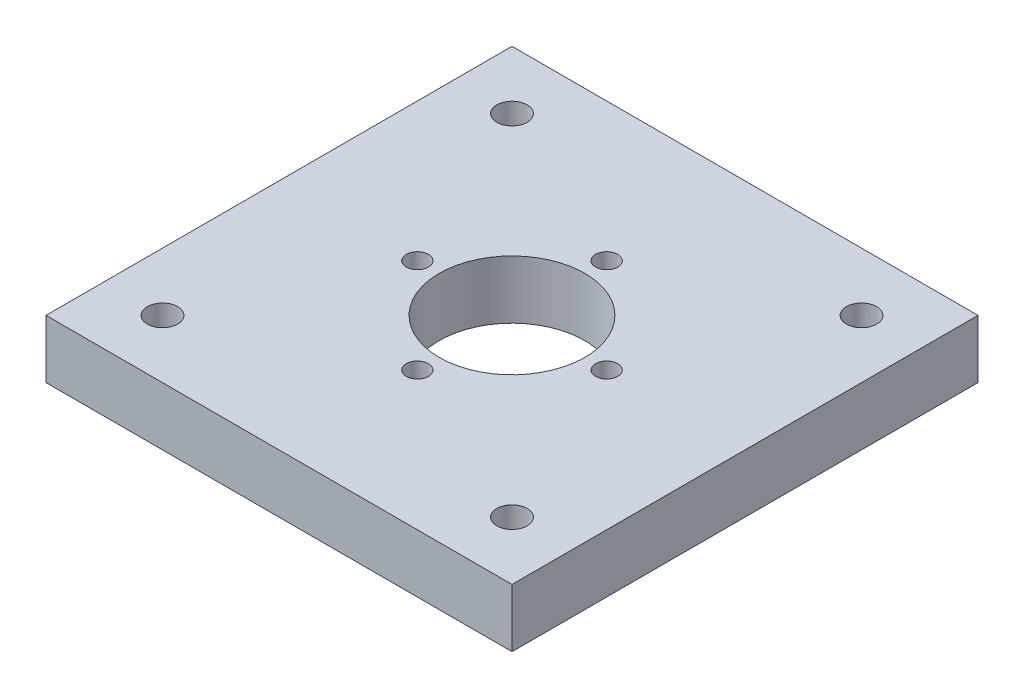
ISO-10303-21;
HEADER;
FILE_DESCRIPTION(('STEP AP214'),'2;1');
FILE_NAME('part.step','',(''),(''),'','','');
FILE_SCHEMA(('AUTOMOTIVE_DESIGN { 1 0 10303 214 1 1 1 1 }'));
ENDSEC;
DATA;
#1=APPLICATION_CONTEXT('core data for automotive mechanical design processes');
#2=APPLICATION_PROTOCOL_DEFINITION('international standard','automotive_design',2000,#1);
#3=PRODUCT_CONTEXT('',#1,'mechanical');
#4=PRODUCT('Part','Part','',(#3));
#5=PRODUCT_RELATED_PRODUCT_CATEGORY('part','',(#4));
#6=PRODUCT_DEFINITION_FORMATION('','',#4);
#7=PRODUCT_DEFINITION_CONTEXT('part definition',#1,'design');
#8=PRODUCT_DEFINITION('design','',#6,#7);
#9=PRODUCT_DEFINITION_SHAPE('','',#8);
#10=(LENGTH_UNIT() NAMED_UNIT(*) SI_UNIT(.MILLI.,.METRE.));
#11=(NAMED_UNIT(*) PLANE_ANGLE_UNIT() SI_UNIT($,.RADIAN.));
#12=(NAMED_UNIT(*) SI_UNIT($,.STERADIAN.) SOLID_ANGLE_UNIT());
#13=UNCERTAINTY_MEASURE_WITH_UNIT(LENGTH_MEASURE(1.E-05),#10,'distance_accuracy_value','');
#14=(GEOMETRIC_REPRESENTATION_CONTEXT(3) GLOBAL_UNCERTAINTY_ASSIGNED_CONTEXT((#13)) GLOBAL_UNIT_ASSIGNED_CONTEXT((#10,
#11,#12)) REPRESENTATION_CONTEXT('',''));
#15=CARTESIAN_POINT('',(0.,0.,0.));
#16=DIRECTION('',(0.,0.,1.));
#17=DIRECTION('',(1.,0.,0.));
#18=AXIS2_PLACEMENT_3D('',#15,#16,#17);
#19=CARTESIAN_POINT('',(50.8,6.35,-50.8));
#20=DIRECTION('',(-1.,0.,0.));
#21=DIRECTION('',(0.,0.,1.));
#22=AXIS2_PLACEMENT_3D('',#19,#20,#21);
#23=PLANE('',#22);
#24=DIRECTION('',(0.,0.,-1.));
#25=VECTOR('',#24,1.);
#26=CARTESIAN_POINT('',(50.8,-6.35,-50.8));
#27=LINE('',#26,#25);
#28=CARTESIAN_POINT('',(50.8,-6.35,50.8));
#29=VERTEX_POINT('',#28);
#30=CARTESIAN_POINT('',(50.8,-6.35,-50.8));
#31=VERTEX_POINT('',#30);
#32=EDGE_CURVE('E102',#29,#31,#27,.T.);
#33=ORIENTED_EDGE('',*,*,#32,.T.);
#34=DIRECTION('',(0.,-1.,0.));
#35=VECTOR('',#34,1.);
#36=CARTESIAN_POINT('',(50.8,6.35,-50.8));
#37=LINE('',#36,#35);
#38=CARTESIAN_POINT('',(50.8,6.35,-50.8));
#39=VERTEX_POINT('',#38);
#40=EDGE_CURVE('E11',#39,#31,#37,.T.);
#41=ORIENTED_EDGE('',*,*,#40,.F.);
#42=DIRECTION('',(0.,0.,-1.));
#43=VECTOR('',#42,1.);
#44=CARTESIAN_POINT('',(50.8,6.35,-50.8));
#45=LINE('',#44,#43);
#46=CARTESIAN_POINT('',(50.8,6.35,50.8));
#47=VERTEX_POINT('',#46);
#48=EDGE_CURVE('E90',#47,#39,#45,.T.);
#49=ORIENTED_EDGE('',*,*,#48,.F.);
#50=DIRECTION('',(0.,-1.,0.));
#51=VECTOR('',#50,1.);
#52=CARTESIAN_POINT('',(50.8,6.35,50.8));
#53=LINE('',#52,#51);
#54=EDGE_CURVE('E98',#47,#29,#53,.T.);
#55=ORIENTED_EDGE('',*,*,#54,.T.);
#56=EDGE_LOOP('',(#33,#41,#49,#55));
#57=FACE_BOUND('',#56,.T.);
#58=ADVANCED_FACE('F39',(#57),#23,.F.);
#59=CARTESIAN_POINT('',(-50.8,6.35,-50.8));
#60=DIRECTION('',(0.,0.,1.));
#61=DIRECTION('',(1.,0.,0.));
#62=AXIS2_PLACEMENT_3D('',#59,#60,#61);
#63=PLANE('',#62);
#64=DIRECTION('',(-1.,0.,0.));
#65=VECTOR('',#64,1.);
#66=CARTESIAN_POINT('',(-50.8,-6.35,-50.8));
#67=LINE('',#66,#65);
#68=CARTESIAN_POINT('',(-50.8,-6.35,-50.8));
#69=VERTEX_POINT('',#68);
#70=EDGE_CURVE('E94',#31,#69,#67,.T.);
#71=ORIENTED_EDGE('',*,*,#70,.T.);
#72=DIRECTION('',(0.,-1.,0.));
#73=VECTOR('',#72,1.);
#74=CARTESIAN_POINT('',(-50.8,6.35,-50.8));
#75=LINE('',#74,#73);
#76=CARTESIAN_POINT('',(-50.8,6.35,-50.8));
#77=VERTEX_POINT('',#76);
#78=EDGE_CURVE('E47',#77,#69,#75,.T.);
#79=ORIENTED_EDGE('',*,*,#78,.F.);
#80=DIRECTION('',(-1.,0.,0.));
#81=VECTOR('',#80,1.);
#82=CARTESIAN_POINT('',(-50.8,6.35,-50.8));
#83=LINE('',#82,#81);
#84=EDGE_CURVE('E85',#39,#77,#83,.T.);
#85=ORIENTED_EDGE('',*,*,#84,.F.);
#86=ORIENTED_EDGE('',*,*,#40,.T.);
#87=EDGE_LOOP('',(#71,#79,#85,#86));
#88=FACE_BOUND('',#87,.T.);
#89=ADVANCED_FACE('F93',(#88),#63,.F.);
#90=CARTESIAN_POINT('',(-50.8,6.35,-50.8));
#91=DIRECTION('',(1.,0.,0.));
#92=DIRECTION('',(0.,0.,-1.));
#93=AXIS2_PLACEMENT_3D('',#90,#91,#92);
#94=PLANE('',#93);
#95=DIRECTION('',(0.,0.,1.));
#96=VECTOR('',#95,1.);
#97=CARTESIAN_POINT('',(-50.8,-6.35,-50.8));
#98=LINE('',#97,#96);
#99=CARTESIAN_POINT('',(-50.8,-6.35,50.8));
#100=VERTEX_POINT('',#99);
#101=EDGE_CURVE('E72',#69,#100,#98,.T.);
#102=ORIENTED_EDGE('',*,*,#101,.T.);
#103=DIRECTION('',(0.,-1.,0.));
#104=VECTOR('',#103,1.);
#105=CARTESIAN_POINT('',(-50.8,6.35,50.8));
#106=LINE('',#105,#104);
#107=CARTESIAN_POINT('',(-50.8,6.35,50.8));
#108=VERTEX_POINT('',#107);
#109=EDGE_CURVE('E95',#108,#100,#106,.T.);
#110=ORIENTED_EDGE('',*,*,#109,.F.);
#111=DIRECTION('',(0.,0.,1.));
#112=VECTOR('',#111,1.);
#113=CARTESIAN_POINT('',(-50.8,6.35,-50.8));
#114=LINE('',#113,#112);
#115=EDGE_CURVE('E88',#77,#108,#114,.T.);
#116=ORIENTED_EDGE('',*,*,#115,.F.);
#117=ORIENTED_EDGE('',*,*,#78,.T.);
#118=EDGE_LOOP('',(#102,#110,#116,#117));
#119=FACE_BOUND('',#118,.T.);
#120=ADVANCED_FACE('F96',(#119),#94,.F.);
#121=CARTESIAN_POINT('',(-50.8,6.35,50.8));
#122=DIRECTION('',(0.,0.,-1.));
#123=DIRECTION('',(-1.,0.,0.));
#124=AXIS2_PLACEMENT_3D('',#121,#122,#123);
#125=PLANE('',#124);
#126=DIRECTION('',(1.,0.,0.));
#127=VECTOR('',#126,1.);
#128=CARTESIAN_POINT('',(-50.8,-6.35,50.8));
#129=LINE('',#128,#127);
#130=EDGE_CURVE('E78',#100,#29,#129,.T.);
#131=ORIENTED_EDGE('',*,*,#130,.T.);
#132=ORIENTED_EDGE('',*,*,#54,.F.);
#133=DIRECTION('',(1.,0.,0.));
#134=VECTOR('',#133,1.);
#135=CARTESIAN_POINT('',(-50.8,6.35,50.8));
#136=LINE('',#135,#134);
#137=EDGE_CURVE('E55',#108,#47,#136,.T.);
#138=ORIENTED_EDGE('',*,*,#137,.F.);
#139=ORIENTED_EDGE('',*,*,#109,.T.);
#140=EDGE_LOOP('',(#131,#132,#138,#139));
#141=FACE_BOUND('',#140,.T.);
#142=ADVANCED_FACE('F110',(#141),#125,.F.);
#143=CARTESIAN_POINT('',(0.,6.35,0.));
#144=DIRECTION('',(0.,1.,0.));
#145=DIRECTION('',(0.,0.,1.));
#146=AXIS2_PLACEMENT_3D('',#143,#144,#145);
#147=PLANE('',#146);
#148=CARTESIAN_POINT('',(0.,6.35,-20.6375));
#149=DIRECTION('',(0.,1.,0.));
#150=DIRECTION('',(0.,0.,1.));
#151=AXIS2_PLACEMENT_3D('',#148,#149,#150);
#152=CIRCLE('',#151,2.413);
#153=CARTESIAN_POINT('',(0.,6.35,-18.2245));
#154=VERTEX_POINT('',#153);
#155=EDGE_CURVE('E143',#154,#154,#152,.T.);
#156=ORIENTED_EDGE('',*,*,#155,.F.);
#157=EDGE_LOOP('',(#156));
#158=FACE_BOUND('',#157,.T.);
#159=CARTESIAN_POINT('',(20.6375,6.35,0.));
#160=DIRECTION('',(0.,1.,0.));
#161=DIRECTION('',(0.,0.,1.));
#162=AXIS2_PLACEMENT_3D('',#159,#160,#161);
#163=CIRCLE('',#162,2.413);
#164=CARTESIAN_POINT('',(20.6375,6.35,2.413));
#165=VERTEX_POINT('',#164);
#166=EDGE_CURVE('E149',#165,#165,#163,.T.);
#167=ORIENTED_EDGE('',*,*,#166,.F.);
#168=EDGE_LOOP('',(#167));
#169=FACE_BOUND('',#168,.T.);
#170=CARTESIAN_POINT('',(0.,6.35,20.6375));
#171=DIRECTION('',(0.,1.,0.));
#172=DIRECTION('',(0.,0.,1.));
#173=AXIS2_PLACEMENT_3D('',#170,#171,#172);
#174=CIRCLE('',#173,2.413);
#175=CARTESIAN_POINT('',(0.,6.35,23.0505));
#176=VERTEX_POINT('',#175);
#177=EDGE_CURVE('E150',#176,#176,#174,.T.);
#178=ORIENTED_EDGE('',*,*,#177,.F.);
#179=EDGE_LOOP('',(#178));
#180=FACE_BOUND('',#179,.T.);
#181=CARTESIAN_POINT('',(-20.6375,6.35,0.));
#182=DIRECTION('',(0.,1.,0.));
#183=DIRECTION('',(0.,0.,1.));
#184=AXIS2_PLACEMENT_3D('',#181,#182,#183);
#185=CIRCLE('',#184,2.413);
#186=CARTESIAN_POINT('',(-20.6375,6.35,2.413));
#187=VERTEX_POINT('',#186);
#188=EDGE_CURVE('E161',#187,#187,#185,.T.);
#189=ORIENTED_EDGE('',*,*,#188,.F.);
#190=EDGE_LOOP('',(#189));
#191=FACE_BOUND('',#190,.T.);
#192=CARTESIAN_POINT('',(0.,6.35,0.));
#193=DIRECTION('',(0.,1.,0.));
#194=DIRECTION('',(0.,0.,1.));
#195=AXIS2_PLACEMENT_3D('',#192,#193,#194);
#196=CIRCLE('',#195,15.875);
#197=CARTESIAN_POINT('',(0.,6.35,15.875));
#198=VERTEX_POINT('',#197);
#199=EDGE_CURVE('E140',#198,#198,#196,.T.);
#200=ORIENTED_EDGE('',*,*,#199,.F.);
#201=EDGE_LOOP('',(#200));
#202=FACE_BOUND('',#201,.T.);
#203=CARTESIAN_POINT('',(-38.1,6.35,-38.1));
#204=DIRECTION('',(0.,1.,0.));
#205=DIRECTION('',(0.,0.,-1.));
#206=AXIS2_PLACEMENT_3D('',#203,#204,#205);
#207=CIRCLE('',#206,3.302);
#208=CARTESIAN_POINT('',(-38.1,6.35,-41.402));
#209=VERTEX_POINT('',#208);
#210=EDGE_CURVE('E119',#209,#209,#207,.T.);
#211=ORIENTED_EDGE('',*,*,#210,.F.);
#212=EDGE_LOOP('',(#211));
#213=FACE_BOUND('',#212,.T.);
#214=CARTESIAN_POINT('',(38.1,6.35,38.1));
#215=DIRECTION('',(0.,1.,0.));
#216=DIRECTION('',(0.,0.,-1.));
#217=AXIS2_PLACEMENT_3D('',#214,#215,#216);
#218=CIRCLE('',#217,3.302);
#219=CARTESIAN_POINT('',(38.1,6.35,34.798));
#220=VERTEX_POINT('',#219);
#221=EDGE_CURVE('E125',#220,#220,#218,.T.);
#222=ORIENTED_EDGE('',*,*,#221,.F.);
#223=EDGE_LOOP('',(#222));
#224=FACE_BOUND('',#223,.T.);
#225=CARTESIAN_POINT('',(38.1,6.35,-38.1));
#226=DIRECTION('',(0.,1.,0.));
#227=DIRECTION('',(0.,0.,1.));
#228=AXIS2_PLACEMENT_3D('',#225,#226,#227);
#229=CIRCLE('',#228,3.302);
#230=CARTESIAN_POINT('',(38.1,6.35,-34.798));
#231=VERTEX_POINT('',#230);
#232=EDGE_CURVE('E126',#231,#231,#229,.T.);
#233=ORIENTED_EDGE('',*,*,#232,.F.);
#234=EDGE_LOOP('',(#233));
#235=FACE_BOUND('',#234,.T.);
#236=CARTESIAN_POINT('',(-38.1,6.35,38.1));
#237=DIRECTION('',(0.,1.,0.));
#238=DIRECTION('',(0.,0.,1.));
#239=AXIS2_PLACEMENT_3D('',#236,#237,#238);
#240=CIRCLE('',#239,3.302);
#241=CARTESIAN_POINT('',(-38.1,6.35,41.402));
#242=VERTEX_POINT('',#241);
#243=EDGE_CURVE('E116',#242,#242,#240,.T.);
#244=ORIENTED_EDGE('',*,*,#243,.F.);
#245=EDGE_LOOP('',(#244));
#246=FACE_BOUND('',#245,.T.);
#247=ORIENTED_EDGE('',*,*,#48,.T.);
#248=ORIENTED_EDGE('',*,*,#84,.T.);
#249=ORIENTED_EDGE('',*,*,#115,.T.);
#250=ORIENTED_EDGE('',*,*,#137,.T.);
#251=EDGE_LOOP('',(#247,#248,#249,#250));
#252=FACE_BOUND('',#251,.T.);
#253=ADVANCED_FACE('F86',(#158,#169,#180,#191,#202,#213,#224,#235,#246,#252),#147,.T.);
#254=CARTESIAN_POINT('',(0.,-6.35,0.));
#255=DIRECTION('',(0.,1.,0.));
#256=DIRECTION('',(0.,0.,1.));
#257=AXIS2_PLACEMENT_3D('',#254,#255,#256);
#258=PLANE('',#257);
#259=CARTESIAN_POINT('',(0.,-6.35,-20.6375));
#260=DIRECTION('',(0.,1.,0.));
#261=DIRECTION('',(0.,0.,1.));
#262=AXIS2_PLACEMENT_3D('',#259,#260,#261);
#263=CIRCLE('',#262,2.413);
#264=CARTESIAN_POINT('',(0.,-6.35,-18.2245));
#265=VERTEX_POINT('',#264);
#266=EDGE_CURVE('E153',#265,#265,#263,.T.);
#267=ORIENTED_EDGE('',*,*,#266,.T.);
#268=EDGE_LOOP('',(#267));
#269=FACE_BOUND('',#268,.T.);
#270=CARTESIAN_POINT('',(20.6375,-6.35,0.));
#271=DIRECTION('',(0.,1.,0.));
#272=DIRECTION('',(0.,0.,1.));
#273=AXIS2_PLACEMENT_3D('',#270,#271,#272);
#274=CIRCLE('',#273,2.413);
#275=CARTESIAN_POINT('',(20.6375,-6.35,2.413));
#276=VERTEX_POINT('',#275);
#277=EDGE_CURVE('E146',#276,#276,#274,.T.);
#278=ORIENTED_EDGE('',*,*,#277,.T.);
#279=EDGE_LOOP('',(#278));
#280=FACE_BOUND('',#279,.T.);
#281=CARTESIAN_POINT('',(0.,-6.35,20.6375));
#282=DIRECTION('',(0.,1.,0.));
#283=DIRECTION('',(0.,0.,1.));
#284=AXIS2_PLACEMENT_3D('',#281,#282,#283);
#285=CIRCLE('',#284,2.413);
#286=CARTESIAN_POINT('',(0.,-6.35,23.0505));
#287=VERTEX_POINT('',#286);
#288=EDGE_CURVE('E164',#287,#287,#285,.T.);
#289=ORIENTED_EDGE('',*,*,#288,.T.);
#290=EDGE_LOOP('',(#289));
#291=FACE_BOUND('',#290,.T.);
#292=CARTESIAN_POINT('',(-20.6375,-6.35,0.));
#293=DIRECTION('',(0.,1.,0.));
#294=DIRECTION('',(0.,0.,1.));
#295=AXIS2_PLACEMENT_3D('',#292,#293,#294);
#296=CIRCLE('',#295,2.413);
#297=CARTESIAN_POINT('',(-20.6375,-6.35,2.413));
#298=VERTEX_POINT('',#297);
#299=EDGE_CURVE('E158',#298,#298,#296,.T.);
#300=ORIENTED_EDGE('',*,*,#299,.T.);
#301=EDGE_LOOP('',(#300));
#302=FACE_BOUND('',#301,.T.);
#303=CARTESIAN_POINT('',(0.,-6.35,0.));
#304=DIRECTION('',(0.,1.,0.));
#305=DIRECTION('',(0.,0.,1.));
#306=AXIS2_PLACEMENT_3D('',#303,#304,#305);
#307=CIRCLE('',#306,15.875);
#308=CARTESIAN_POINT('',(0.,-6.35,15.875));
#309=VERTEX_POINT('',#308);
#310=EDGE_CURVE('E137',#309,#309,#307,.T.);
#311=ORIENTED_EDGE('',*,*,#310,.T.);
#312=EDGE_LOOP('',(#311));
#313=FACE_BOUND('',#312,.T.);
#314=CARTESIAN_POINT('',(-38.1,-6.35,-38.1));
#315=DIRECTION('',(0.,1.,0.));
#316=DIRECTION('',(0.,0.,-1.));
#317=AXIS2_PLACEMENT_3D('',#314,#315,#316);
#318=CIRCLE('',#317,3.302);
#319=CARTESIAN_POINT('',(-38.1,-6.35,-41.402));
#320=VERTEX_POINT('',#319);
#321=EDGE_CURVE('E129',#320,#320,#318,.T.);
#322=ORIENTED_EDGE('',*,*,#321,.T.);
#323=EDGE_LOOP('',(#322));
#324=FACE_BOUND('',#323,.T.);
#325=CARTESIAN_POINT('',(38.1,-6.35,38.1));
#326=DIRECTION('',(0.,1.,0.));
#327=DIRECTION('',(0.,0.,-1.));
#328=AXIS2_PLACEMENT_3D('',#325,#326,#327);
#329=CIRCLE('',#328,3.302);
#330=CARTESIAN_POINT('',(38.1,-6.35,34.798));
#331=VERTEX_POINT('',#330);
#332=EDGE_CURVE('E122',#331,#331,#329,.T.);
#333=ORIENTED_EDGE('',*,*,#332,.T.);
#334=EDGE_LOOP('',(#333));
#335=FACE_BOUND('',#334,.T.);
#336=CARTESIAN_POINT('',(38.1,-6.35,-38.1));
#337=DIRECTION('',(0.,1.,0.));
#338=DIRECTION('',(0.,0.,1.));
#339=AXIS2_PLACEMENT_3D('',#336,#337,#338);
#340=CIRCLE('',#339,3.302);
#341=CARTESIAN_POINT('',(38.1,-6.35,-34.798));
#342=VERTEX_POINT('',#341);
#343=EDGE_CURVE('E134',#342,#342,#340,.T.);
#344=ORIENTED_EDGE('',*,*,#343,.T.);
#345=EDGE_LOOP('',(#344));
#346=FACE_BOUND('',#345,.T.);
#347=CARTESIAN_POINT('',(-38.1,-6.35,38.1));
#348=DIRECTION('',(0.,1.,0.));
#349=DIRECTION('',(0.,0.,1.));
#350=AXIS2_PLACEMENT_3D('',#347,#348,#349);
#351=CIRCLE('',#350,3.302);
#352=CARTESIAN_POINT('',(-38.1,-6.35,41.402));
#353=VERTEX_POINT('',#352);
#354=EDGE_CURVE('E105',#353,#353,#351,.T.);
#355=ORIENTED_EDGE('',*,*,#354,.T.);
#356=EDGE_LOOP('',(#355));
#357=FACE_BOUND('',#356,.T.);
#358=ORIENTED_EDGE('',*,*,#32,.F.);
#359=ORIENTED_EDGE('',*,*,#130,.F.);
#360=ORIENTED_EDGE('',*,*,#101,.F.);
#361=ORIENTED_EDGE('',*,*,#70,.F.);
#362=EDGE_LOOP('',(#358,#359,#360,#361));
#363=FACE_BOUND('',#362,.T.);
#364=ADVANCED_FACE('F113',(#269,#280,#291,#302,#313,#324,#335,#346,#357,#363),#258,.F.);
#365=CARTESIAN_POINT('',(-38.1,-6.35,38.1));
#366=DIRECTION('',(0.,1.,0.));
#367=DIRECTION('',(0.,0.,1.));
#368=AXIS2_PLACEMENT_3D('',#365,#366,#367);
#369=CYLINDRICAL_SURFACE('',#368,3.302);
#370=ORIENTED_EDGE('',*,*,#354,.F.);
#371=EDGE_LOOP('',(#370));
#372=FACE_BOUND('',#371,.T.);
#373=ORIENTED_EDGE('',*,*,#243,.T.);
#374=EDGE_LOOP('',(#373));
#375=FACE_BOUND('',#374,.T.);
#376=ADVANCED_FACE('F188',(#372,#375),#369,.F.);
#377=CARTESIAN_POINT('',(38.1,-6.35,-38.1));
#378=DIRECTION('',(0.,1.,0.));
#379=DIRECTION('',(0.,0.,1.));
#380=AXIS2_PLACEMENT_3D('',#377,#378,#379);
#381=CYLINDRICAL_SURFACE('',#380,3.302);
#382=ORIENTED_EDGE('',*,*,#343,.F.);
#383=EDGE_LOOP('',(#382));
#384=FACE_BOUND('',#383,.T.);
#385=ORIENTED_EDGE('',*,*,#232,.T.);
#386=EDGE_LOOP('',(#385));
#387=FACE_BOUND('',#386,.T.);
#388=ADVANCED_FACE('F190',(#384,#387),#381,.F.);
#389=CARTESIAN_POINT('',(38.1,-6.35,38.1));
#390=DIRECTION('',(0.,1.,0.));
#391=DIRECTION('',(0.,0.,1.));
#392=AXIS2_PLACEMENT_3D('',#389,#390,#391);
#393=CYLINDRICAL_SURFACE('',#392,3.302);
#394=ORIENTED_EDGE('',*,*,#332,.F.);
#395=EDGE_LOOP('',(#394));
#396=FACE_BOUND('',#395,.T.);
#397=ORIENTED_EDGE('',*,*,#221,.T.);
#398=EDGE_LOOP('',(#397));
#399=FACE_BOUND('',#398,.T.);
#400=ADVANCED_FACE('F197',(#396,#399),#393,.F.);
#401=CARTESIAN_POINT('',(-38.1,-6.35,-38.1));
#402=DIRECTION('',(0.,1.,0.));
#403=DIRECTION('',(0.,0.,1.));
#404=AXIS2_PLACEMENT_3D('',#401,#402,#403);
#405=CYLINDRICAL_SURFACE('',#404,3.302);
#406=ORIENTED_EDGE('',*,*,#321,.F.);
#407=EDGE_LOOP('',(#406));
#408=FACE_BOUND('',#407,.T.);
#409=ORIENTED_EDGE('',*,*,#210,.T.);
#410=EDGE_LOOP('',(#409));
#411=FACE_BOUND('',#410,.T.);
#412=ADVANCED_FACE('F258',(#408,#411),#405,.F.);
#413=CARTESIAN_POINT('',(0.,-6.35,0.));
#414=DIRECTION('',(0.,1.,0.));
#415=DIRECTION('',(0.,0.,1.));
#416=AXIS2_PLACEMENT_3D('',#413,#414,#415);
#417=CYLINDRICAL_SURFACE('',#416,15.875);
#418=ORIENTED_EDGE('',*,*,#310,.F.);
#419=EDGE_LOOP('',(#418));
#420=FACE_BOUND('',#419,.T.);
#421=ORIENTED_EDGE('',*,*,#199,.T.);
#422=EDGE_LOOP('',(#421));
#423=FACE_BOUND('',#422,.T.);
#424=ADVANCED_FACE('F266',(#420,#423),#417,.F.);
#425=CARTESIAN_POINT('',(-20.6375,-6.35,0.));
#426=DIRECTION('',(0.,1.,0.));
#427=DIRECTION('',(0.,0.,1.));
#428=AXIS2_PLACEMENT_3D('',#425,#426,#427);
#429=CYLINDRICAL_SURFACE('',#428,2.413);
#430=ORIENTED_EDGE('',*,*,#299,.F.);
#431=EDGE_LOOP('',(#430));
#432=FACE_BOUND('',#431,.T.);
#433=ORIENTED_EDGE('',*,*,#188,.T.);
#434=EDGE_LOOP('',(#433));
#435=FACE_BOUND('',#434,.T.);
#436=ADVANCED_FACE('F275',(#432,#435),#429,.F.);
#437=CARTESIAN_POINT('',(0.,-6.35,20.6375));
#438=DIRECTION('',(0.,1.,0.));
#439=DIRECTION('',(0.,0.,1.));
#440=AXIS2_PLACEMENT_3D('',#437,#438,#439);
#441=CYLINDRICAL_SURFACE('',#440,2.413);
#442=ORIENTED_EDGE('',*,*,#288,.F.);
#443=EDGE_LOOP('',(#442));
#444=FACE_BOUND('',#443,.T.);
#445=ORIENTED_EDGE('',*,*,#177,.T.);
#446=EDGE_LOOP('',(#445));
#447=FACE_BOUND('',#446,.T.);
#448=ADVANCED_FACE('F170',(#444,#447),#441,.F.);
#449=CARTESIAN_POINT('',(20.6375,-6.35,0.));
#450=DIRECTION('',(0.,1.,0.));
#451=DIRECTION('',(0.,0.,1.));
#452=AXIS2_PLACEMENT_3D('',#449,#450,#451);
#453=CYLINDRICAL_SURFACE('',#452,2.413);
#454=ORIENTED_EDGE('',*,*,#277,.F.);
#455=EDGE_LOOP('',(#454));
#456=FACE_BOUND('',#455,.T.);
#457=ORIENTED_EDGE('',*,*,#166,.T.);
#458=EDGE_LOOP('',(#457));
#459=FACE_BOUND('',#458,.T.);
#460=ADVANCED_FACE('F292',(#456,#459),#453,.F.);
#461=CARTESIAN_POINT('',(0.,-6.35,-20.6375));
#462=DIRECTION('',(0.,1.,0.));
#463=DIRECTION('',(0.,0.,1.));
#464=AXIS2_PLACEMENT_3D('',#461,#462,#463);
#465=CYLINDRICAL_SURFACE('',#464,2.413);
#466=ORIENTED_EDGE('',*,*,#266,.F.);
#467=EDGE_LOOP('',(#466));
#468=FACE_BOUND('',#467,.T.);
#469=ORIENTED_EDGE('',*,*,#155,.T.);
#470=EDGE_LOOP('',(#469));
#471=FACE_BOUND('',#470,.T.);
#472=ADVANCED_FACE('F301',(#468,#471),#465,.F.);
#473=CLOSED_SHELL('',(#58,#89,#120,#142,#253,#364,#376,#388,#400,#412,#424,#436,#448,#460,#472));
#474=MANIFOLD_SOLID_BREP('B2',#473);
#475=ADVANCED_BREP_SHAPE_REPRESENTATION('',(#18,#474),#14);
#476=SHAPE_DEFINITION_REPRESENTATION(#9,#475);
ENDSEC;
END-ISO-10303-21;
